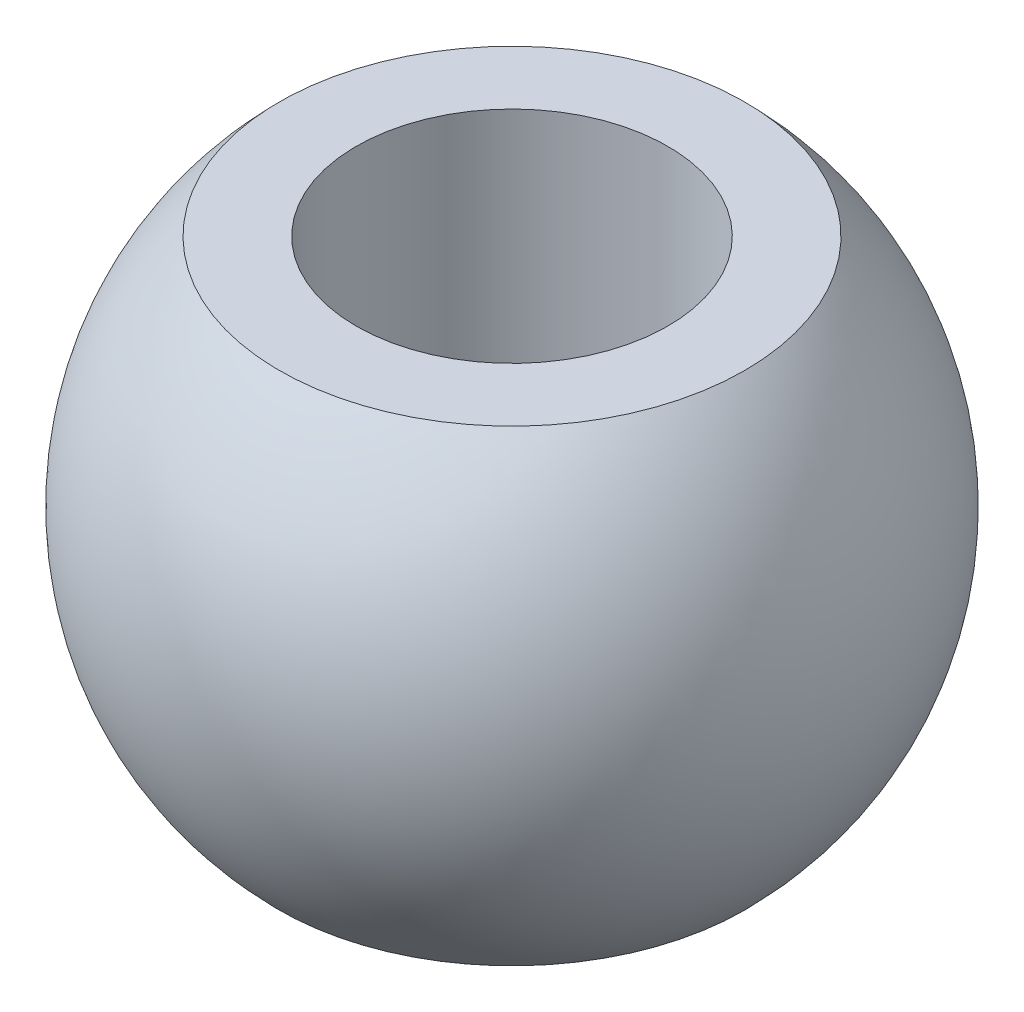
ISO-10303-21;
HEADER;
FILE_DESCRIPTION(('STEP AP214'),'2;1');
FILE_NAME('part.step','',(''),(''),'','','');
FILE_SCHEMA(('AUTOMOTIVE_DESIGN { 1 0 10303 214 1 1 1 1 }'));
ENDSEC;
DATA;
#1=APPLICATION_CONTEXT('core data for automotive mechanical design processes');
#2=APPLICATION_PROTOCOL_DEFINITION('international standard','automotive_design',2000,#1);
#3=PRODUCT_CONTEXT('',#1,'mechanical');
#4=PRODUCT('Part','Part','',(#3));
#5=PRODUCT_RELATED_PRODUCT_CATEGORY('part','',(#4));
#6=PRODUCT_DEFINITION_FORMATION('','',#4);
#7=PRODUCT_DEFINITION_CONTEXT('part definition',#1,'design');
#8=PRODUCT_DEFINITION('design','',#6,#7);
#9=PRODUCT_DEFINITION_SHAPE('','',#8);
#10=(LENGTH_UNIT() NAMED_UNIT(*) SI_UNIT(.MILLI.,.METRE.));
#11=(NAMED_UNIT(*) PLANE_ANGLE_UNIT() SI_UNIT($,.RADIAN.));
#12=(NAMED_UNIT(*) SI_UNIT($,.STERADIAN.) SOLID_ANGLE_UNIT());
#13=UNCERTAINTY_MEASURE_WITH_UNIT(LENGTH_MEASURE(1.E-05),#10,'distance_accuracy_value','');
#14=(GEOMETRIC_REPRESENTATION_CONTEXT(3) GLOBAL_UNCERTAINTY_ASSIGNED_CONTEXT((#13)) GLOBAL_UNIT_ASSIGNED_CONTEXT((#10,
#11,#12)) REPRESENTATION_CONTEXT('',''));
#15=CARTESIAN_POINT('',(0.,0.,0.));
#16=DIRECTION('',(0.,0.,1.));
#17=DIRECTION('',(1.,0.,0.));
#18=AXIS2_PLACEMENT_3D('',#15,#16,#17);
#19=CARTESIAN_POINT('',(0.,0.,0.));
#20=DIRECTION('',(0.,1.,0.));
#21=DIRECTION('',(1.,0.,0.));
#22=AXIS2_PLACEMENT_3D('',#19,#20,#21);
#23=SPHERICAL_SURFACE('',#22,6.35);
#24=CARTESIAN_POINT('',(0.,-4.5,0.));
#25=DIRECTION('',(0.,1.,0.));
#26=DIRECTION('',(0.,0.,1.));
#27=AXIS2_PLACEMENT_3D('',#24,#25,#26);
#28=CIRCLE('',#27,4.48023436886956);
#29=CARTESIAN_POINT('',(4.48023436886956,-4.5,0.));
#30=VERTEX_POINT('',#29);
#31=EDGE_CURVE('E10',#30,#30,#28,.T.);
#32=CARTESIAN_POINT('',(0.,4.5,0.));
#33=DIRECTION('',(0.,1.,0.));
#34=DIRECTION('',(0.,0.,1.));
#35=AXIS2_PLACEMENT_3D('',#32,#33,#34);
#36=CIRCLE('',#35,4.48023436886956);
#37=CARTESIAN_POINT('',(4.48023436886956,4.5,0.));
#38=VERTEX_POINT('',#37);
#39=EDGE_CURVE('E48',#38,#38,#36,.T.);
#40=CARTESIAN_POINT('',(4.48023436886956,-4.5,0.));
#41=CARTESIAN_POINT('',(4.55407343945351,-4.4264884024758,0.));
#42=CARTESIAN_POINT('',(4.62609994684988,-4.35115651475781,0.));
#43=CARTESIAN_POINT('',(4.7663605892903,-4.19704125302045,0.));
#44=CARTESIAN_POINT('',(4.83459472433436,-4.11825787900109,0.));
#45=CARTESIAN_POINT('',(4.96710337609299,-3.95742873874721,0.));
#46=CARTESIAN_POINT('',(5.03137789280757,-3.87538297251269,0.));
#47=CARTESIAN_POINT('',(5.15581211628958,-3.70822828588863,0.));
#48=CARTESIAN_POINT('',(5.21597182305701,-3.62311936549909,0.));
#49=CARTESIAN_POINT('',(5.33203054396412,-3.45004442910633,0.));
#50=CARTESIAN_POINT('',(5.38792955810379,-3.36207841310311,0.));
#51=CARTESIAN_POINT('',(5.49533150980227,-3.18350242650159,0.));
#52=CARTESIAN_POINT('',(5.54683444736106,-3.09289245590329,0.));
#53=CARTESIAN_POINT('',(5.64531946454835,-2.90924806328909,0.));
#54=CARTESIAN_POINT('',(5.69230154417684,-2.8162136412732,0.));
#55=CARTESIAN_POINT('',(5.78163102910289,-2.62794573404182,0.));
#56=CARTESIAN_POINT('',(5.82397843440043,-2.53271224882633,0.));
#57=CARTESIAN_POINT('',(5.90393597885495,-2.34027692778351,0.));
#58=CARTESIAN_POINT('',(5.94154611801192,-2.24307509195618,0.));
#59=CARTESIAN_POINT('',(6.01193801581758,-2.04693855164524,0.));
#60=CARTESIAN_POINT('',(6.04471977446626,-1.94800384716163,0.));
#61=CARTESIAN_POINT('',(6.10537549390856,-1.74864124933004,0.));
#62=CARTESIAN_POINT('',(6.13324945470217,-1.64821335598205,0.));
#63=CARTESIAN_POINT('',(6.18402205081498,-1.44610767768191,0.));
#64=CARTESIAN_POINT('',(6.20692068613419,-1.34442989272976,0.));
#65=CARTESIAN_POINT('',(6.24768715691618,-1.1400707564608,0.));
#66=CARTESIAN_POINT('',(6.26555499237897,-1.037389405144,0.));
#67=CARTESIAN_POINT('',(6.29621657671828,-0.831271892635755,0.));
#68=CARTESIAN_POINT('',(6.30901032559481,-0.727835731444312,0.));
#69=CARTESIAN_POINT('',(6.32949274254463,-0.520459184282807,0.));
#70=CARTESIAN_POINT('',(6.33718141061792,-0.416518798312745,0.));
#71=CARTESIAN_POINT('',(6.34743503934561,-0.208385608228455,0.));
#72=CARTESIAN_POINT('',(6.35,-0.104192804114228,0.));
#73=CARTESIAN_POINT('',(6.35,0.104192804114228,0.));
#74=CARTESIAN_POINT('',(6.34743503934561,0.208385608228455,0.));
#75=CARTESIAN_POINT('',(6.33718141061792,0.416518798312745,0.));
#76=CARTESIAN_POINT('',(6.32949274254463,0.520459184282807,0.));
#77=CARTESIAN_POINT('',(6.30901032559481,0.727835731444312,0.));
#78=CARTESIAN_POINT('',(6.29621657671828,0.831271892635755,0.));
#79=CARTESIAN_POINT('',(6.26555499237897,1.037389405144,0.));
#80=CARTESIAN_POINT('',(6.24768715691618,1.1400707564608,0.));
#81=CARTESIAN_POINT('',(6.20692068613419,1.34442989272976,0.));
#82=CARTESIAN_POINT('',(6.18402205081498,1.44610767768191,0.));
#83=CARTESIAN_POINT('',(6.13324945470217,1.64821335598205,0.));
#84=CARTESIAN_POINT('',(6.10537549390856,1.74864124933004,0.));
#85=CARTESIAN_POINT('',(6.04471977446626,1.94800384716163,0.));
#86=CARTESIAN_POINT('',(6.01193801581758,2.04693855164524,0.));
#87=CARTESIAN_POINT('',(5.94154611801192,2.24307509195618,0.));
#88=CARTESIAN_POINT('',(5.90393597885495,2.34027692778351,0.));
#89=CARTESIAN_POINT('',(5.82397843440043,2.53271224882633,0.));
#90=CARTESIAN_POINT('',(5.78163102910289,2.62794573404182,0.));
#91=CARTESIAN_POINT('',(5.69230154417684,2.8162136412732,0.));
#92=CARTESIAN_POINT('',(5.64531946454835,2.90924806328909,0.));
#93=CARTESIAN_POINT('',(5.54683444736106,3.09289245590329,0.));
#94=CARTESIAN_POINT('',(5.49533150980227,3.18350242650159,0.));
#95=CARTESIAN_POINT('',(5.38792955810379,3.36207841310311,0.));
#96=CARTESIAN_POINT('',(5.33203054396411,3.45004442910633,0.));
#97=CARTESIAN_POINT('',(5.21597182305701,3.62311936549909,0.));
#98=CARTESIAN_POINT('',(5.15581211628958,3.70822828588863,0.));
#99=CARTESIAN_POINT('',(5.03137789280757,3.87538297251269,0.));
#100=CARTESIAN_POINT('',(4.96710337609299,3.95742873874721,0.));
#101=CARTESIAN_POINT('',(4.83459472433436,4.11825787900109,0.));
#102=CARTESIAN_POINT('',(4.76636058929031,4.19704125302045,0.));
#103=CARTESIAN_POINT('',(4.62609994684988,4.35115651475781,0.));
#104=CARTESIAN_POINT('',(4.55407343945351,4.4264884024758,0.));
#105=CARTESIAN_POINT('',(4.48023436886956,4.5,0.));
#106=B_SPLINE_CURVE_WITH_KNOTS('',3,(#40,#41,#42,#43,#44,#45,#46,#47,#48,#49,#50,#51,#52,#53,
#54,#55,#56,#57,#58,#59,#60,#61,#62,#63,#64,#65,#66,#67,#68,#69,#70,#71,#72,#73,#74,#75,#76,#77,
#78,#79,#80,#81,#82,#83,#84,#85,#86,#87,#88,#89,#90,#91,#92,#93,#94,#95,#96,#97,#98,#99,#100,
#101,#102,#103,#104,#105),.UNSPECIFIED.,.F.,.F.,(4,2,2,2,2,2,2,2,2,2,2,2,2,2,2,2,2,2,2,2,2,2,2,
2,2,2,2,2,2,2,2,2,4),(0.,0.31254686485643,0.62509372971286,0.937640594569291,1.25018745942572,
1.56273432428215,1.87528118913858,2.18782805399501,2.50037491885144,2.81292178370787,
3.1254686485643,3.43801551342073,3.75056237827716,4.06310924313359,4.37565610799002,
4.68820297284645,5.00074983770288,5.31329670255931,5.62584356741574,5.93839043227217,
6.2509372971286,6.56348416198503,6.87603102684146,7.18857789169789,7.50112475655432,
7.81367162141075,8.12621848626718,8.43876535112361,8.75131221598004,9.06385908083647,
9.37640594569291,9.68895281054933,10.0014996754058),.UNSPECIFIED.);
#107=EDGE_CURVE('BSEAM34',#30,#38,#106,.T.);
#108=ORIENTED_EDGE('',*,*,#31,.T.);
#109=ORIENTED_EDGE('',*,*,#39,.F.);
#110=ORIENTED_EDGE('',*,*,#107,.T.);
#111=ORIENTED_EDGE('',*,*,#107,.F.);
#112=EDGE_LOOP('',(#108,#110,#109,#111));
#113=FACE_BOUND('',#112,.T.);
#114=ADVANCED_FACE('F34',(#113),#23,.T.);
#115=CARTESIAN_POINT('',(4.48023436886956,-4.5,0.));
#116=DIRECTION('',(0.,-1.,0.));
#117=DIRECTION('',(0.,0.,-1.));
#118=AXIS2_PLACEMENT_3D('',#115,#116,#117);
#119=PLANE('',#118);
#120=CARTESIAN_POINT('',(0.,-4.5,0.));
#121=DIRECTION('',(0.,1.,0.));
#122=DIRECTION('',(0.,0.,1.));
#123=AXIS2_PLACEMENT_3D('',#120,#121,#122);
#124=CIRCLE('',#123,3.);
#125=CARTESIAN_POINT('',(0.,-4.5,3.));
#126=VERTEX_POINT('',#125);
#127=EDGE_CURVE('E40',#126,#126,#124,.T.);
#128=ORIENTED_EDGE('',*,*,#127,.T.);
#129=EDGE_LOOP('',(#128));
#130=FACE_BOUND('',#129,.T.);
#131=ORIENTED_EDGE('',*,*,#31,.F.);
#132=EDGE_LOOP('',(#131));
#133=FACE_BOUND('',#132,.T.);
#134=ADVANCED_FACE('F58',(#130,#133),#119,.T.);
#135=CARTESIAN_POINT('',(0.,-4.5,0.));
#136=DIRECTION('',(0.,1.,0.));
#137=DIRECTION('',(0.,0.,1.));
#138=AXIS2_PLACEMENT_3D('',#135,#136,#137);
#139=CYLINDRICAL_SURFACE('',#138,3.);
#140=CARTESIAN_POINT('',(0.,4.5,0.));
#141=DIRECTION('',(0.,1.,0.));
#142=DIRECTION('',(0.,0.,1.));
#143=AXIS2_PLACEMENT_3D('',#140,#141,#142);
#144=CIRCLE('',#143,3.);
#145=CARTESIAN_POINT('',(0.,4.5,3.));
#146=VERTEX_POINT('',#145);
#147=EDGE_CURVE('E44',#146,#146,#144,.T.);
#148=ORIENTED_EDGE('',*,*,#147,.T.);
#149=EDGE_LOOP('',(#148));
#150=FACE_BOUND('',#149,.T.);
#151=ORIENTED_EDGE('',*,*,#127,.F.);
#152=EDGE_LOOP('',(#151));
#153=FACE_BOUND('',#152,.T.);
#154=ADVANCED_FACE('F62',(#150,#153),#139,.F.);
#155=CARTESIAN_POINT('',(3.,4.5,0.));
#156=DIRECTION('',(0.,1.,0.));
#157=DIRECTION('',(0.,0.,1.));
#158=AXIS2_PLACEMENT_3D('',#155,#156,#157);
#159=PLANE('',#158);
#160=ORIENTED_EDGE('',*,*,#39,.T.);
#161=EDGE_LOOP('',(#160));
#162=FACE_BOUND('',#161,.T.);
#163=ORIENTED_EDGE('',*,*,#147,.F.);
#164=EDGE_LOOP('',(#163));
#165=FACE_BOUND('',#164,.T.);
#166=ADVANCED_FACE('F54',(#162,#165),#159,.T.);
#167=CLOSED_SHELL('',(#114,#134,#154,#166));
#168=MANIFOLD_SOLID_BREP('B2',#167);
#169=ADVANCED_BREP_SHAPE_REPRESENTATION('',(#18,#168),#14);
#170=SHAPE_DEFINITION_REPRESENTATION(#9,#169);
ENDSEC;
END-ISO-10303-21;
